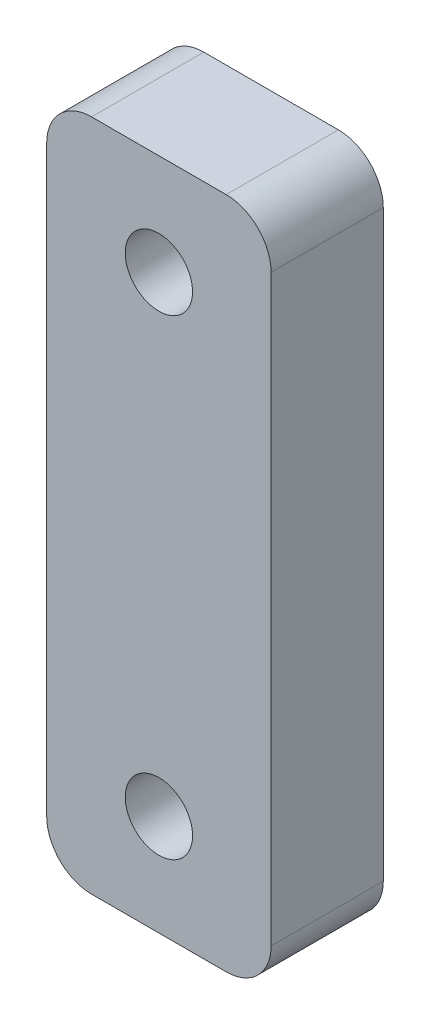
ISO-10303-21;
HEADER;
FILE_DESCRIPTION(('STEP AP214'),'2;1');
FILE_NAME('part.step','',(''),(''),'','','');
FILE_SCHEMA(('AUTOMOTIVE_DESIGN { 1 0 10303 214 1 1 1 1 }'));
ENDSEC;
DATA;
#1=APPLICATION_CONTEXT('core data for automotive mechanical design processes');
#2=APPLICATION_PROTOCOL_DEFINITION('international standard','automotive_design',2000,#1);
#3=PRODUCT_CONTEXT('',#1,'mechanical');
#4=PRODUCT('Part','Part','',(#3));
#5=PRODUCT_RELATED_PRODUCT_CATEGORY('part','',(#4));
#6=PRODUCT_DEFINITION_FORMATION('','',#4);
#7=PRODUCT_DEFINITION_CONTEXT('part definition',#1,'design');
#8=PRODUCT_DEFINITION('design','',#6,#7);
#9=PRODUCT_DEFINITION_SHAPE('','',#8);
#10=(LENGTH_UNIT() NAMED_UNIT(*) SI_UNIT(.MILLI.,.METRE.));
#11=(NAMED_UNIT(*) PLANE_ANGLE_UNIT() SI_UNIT($,.RADIAN.));
#12=(NAMED_UNIT(*) SI_UNIT($,.STERADIAN.) SOLID_ANGLE_UNIT());
#13=UNCERTAINTY_MEASURE_WITH_UNIT(LENGTH_MEASURE(1.E-05),#10,'distance_accuracy_value','');
#14=(GEOMETRIC_REPRESENTATION_CONTEXT(3) GLOBAL_UNCERTAINTY_ASSIGNED_CONTEXT((#13)) GLOBAL_UNIT_ASSIGNED_CONTEXT((#10,
#11,#12)) REPRESENTATION_CONTEXT('',''));
#15=CARTESIAN_POINT('',(0.,0.,0.));
#16=DIRECTION('',(0.,0.,1.));
#17=DIRECTION('',(1.,0.,0.));
#18=AXIS2_PLACEMENT_3D('',#15,#16,#17);
#19=CARTESIAN_POINT('',(-5.,-15.,5.));
#20=DIRECTION('',(1.,0.,0.));
#21=DIRECTION('',(0.,0.,-1.));
#22=AXIS2_PLACEMENT_3D('',#19,#20,#21);
#23=PLANE('',#22);
#24=DIRECTION('',(0.,-1.,0.));
#25=VECTOR('',#24,1.);
#26=CARTESIAN_POINT('',(-5.,-15.,0.));
#27=LINE('',#26,#25);
#28=CARTESIAN_POINT('',(-5.,13.,0.));
#29=VERTEX_POINT('',#28);
#30=CARTESIAN_POINT('',(-5.,-13.,0.));
#31=VERTEX_POINT('',#30);
#32=EDGE_CURVE('E145',#29,#31,#27,.T.);
#33=ORIENTED_EDGE('',*,*,#32,.T.);
#34=DIRECTION('',(0.,0.,-1.));
#35=VECTOR('',#34,1.);
#36=CARTESIAN_POINT('',(-5.,-13.,5.));
#37=LINE('',#36,#35);
#38=CARTESIAN_POINT('',(-5.,-13.,5.));
#39=VERTEX_POINT('',#38);
#40=EDGE_CURVE('E178',#31,#39,#37,.F.);
#41=ORIENTED_EDGE('',*,*,#40,.T.);
#42=DIRECTION('',(0.,-1.,0.));
#43=VECTOR('',#42,1.);
#44=CARTESIAN_POINT('',(-5.,-15.,5.));
#45=LINE('',#44,#43);
#46=CARTESIAN_POINT('',(-5.,13.,5.));
#47=VERTEX_POINT('',#46);
#48=EDGE_CURVE('E143',#47,#39,#45,.T.);
#49=ORIENTED_EDGE('',*,*,#48,.F.);
#50=DIRECTION('',(0.,0.,-1.));
#51=VECTOR('',#50,1.);
#52=CARTESIAN_POINT('',(-5.,13.,5.));
#53=LINE('',#52,#51);
#54=EDGE_CURVE('E174',#47,#29,#53,.T.);
#55=ORIENTED_EDGE('',*,*,#54,.T.);
#56=EDGE_LOOP('',(#33,#41,#49,#55));
#57=FACE_BOUND('',#56,.T.);
#58=ADVANCED_FACE('F42',(#57),#23,.F.);
#59=CARTESIAN_POINT('',(5.,-15.,5.));
#60=DIRECTION('',(0.,1.,0.));
#61=DIRECTION('',(-1.,0.,0.));
#62=AXIS2_PLACEMENT_3D('',#59,#60,#61);
#63=PLANE('',#62);
#64=DIRECTION('',(1.,0.,0.));
#65=VECTOR('',#64,1.);
#66=CARTESIAN_POINT('',(5.,-15.,0.));
#67=LINE('',#66,#65);
#68=CARTESIAN_POINT('',(-3.,-15.,0.));
#69=VERTEX_POINT('',#68);
#70=CARTESIAN_POINT('',(3.,-15.,0.));
#71=VERTEX_POINT('',#70);
#72=EDGE_CURVE('E139',#69,#71,#67,.T.);
#73=ORIENTED_EDGE('',*,*,#72,.T.);
#74=DIRECTION('',(0.,0.,-1.));
#75=VECTOR('',#74,1.);
#76=CARTESIAN_POINT('',(3.,-15.,5.));
#77=LINE('',#76,#75);
#78=CARTESIAN_POINT('',(3.,-15.,5.));
#79=VERTEX_POINT('',#78);
#80=EDGE_CURVE('E114',#71,#79,#77,.F.);
#81=ORIENTED_EDGE('',*,*,#80,.T.);
#82=DIRECTION('',(1.,0.,0.));
#83=VECTOR('',#82,1.);
#84=CARTESIAN_POINT('',(5.,-15.,5.));
#85=LINE('',#84,#83);
#86=CARTESIAN_POINT('',(-3.,-15.,5.));
#87=VERTEX_POINT('',#86);
#88=EDGE_CURVE('E185',#87,#79,#85,.T.);
#89=ORIENTED_EDGE('',*,*,#88,.F.);
#90=DIRECTION('',(0.,0.,-1.));
#91=VECTOR('',#90,1.);
#92=CARTESIAN_POINT('',(-3.,-15.,5.));
#93=LINE('',#92,#91);
#94=EDGE_CURVE('E120',#87,#69,#93,.T.);
#95=ORIENTED_EDGE('',*,*,#94,.T.);
#96=EDGE_LOOP('',(#73,#81,#89,#95));
#97=FACE_BOUND('',#96,.T.);
#98=ADVANCED_FACE('F237',(#97),#63,.F.);
#99=CARTESIAN_POINT('',(5.,-15.,5.));
#100=DIRECTION('',(-1.,0.,0.));
#101=DIRECTION('',(0.,0.,1.));
#102=AXIS2_PLACEMENT_3D('',#99,#100,#101);
#103=PLANE('',#102);
#104=DIRECTION('',(0.,1.,0.));
#105=VECTOR('',#104,1.);
#106=CARTESIAN_POINT('',(5.,-15.,5.));
#107=LINE('',#106,#105);
#108=CARTESIAN_POINT('',(5.,-13.,5.));
#109=VERTEX_POINT('',#108);
#110=CARTESIAN_POINT('',(5.,13.,5.));
#111=VERTEX_POINT('',#110);
#112=EDGE_CURVE('E129',#109,#111,#107,.T.);
#113=ORIENTED_EDGE('',*,*,#112,.F.);
#114=DIRECTION('',(0.,0.,-1.));
#115=VECTOR('',#114,1.);
#116=CARTESIAN_POINT('',(5.,-13.,5.));
#117=LINE('',#116,#115);
#118=CARTESIAN_POINT('',(5.,-13.,0.));
#119=VERTEX_POINT('',#118);
#120=EDGE_CURVE('E113',#109,#119,#117,.T.);
#121=ORIENTED_EDGE('',*,*,#120,.T.);
#122=DIRECTION('',(0.,1.,0.));
#123=VECTOR('',#122,1.);
#124=CARTESIAN_POINT('',(5.,-15.,0.));
#125=LINE('',#124,#123);
#126=CARTESIAN_POINT('',(5.,13.,0.));
#127=VERTEX_POINT('',#126);
#128=EDGE_CURVE('E127',#119,#127,#125,.T.);
#129=ORIENTED_EDGE('',*,*,#128,.T.);
#130=DIRECTION('',(0.,0.,-1.));
#131=VECTOR('',#130,1.);
#132=CARTESIAN_POINT('',(5.,13.,5.));
#133=LINE('',#132,#131);
#134=EDGE_CURVE('E132',#127,#111,#133,.F.);
#135=ORIENTED_EDGE('',*,*,#134,.T.);
#136=EDGE_LOOP('',(#113,#121,#129,#135));
#137=FACE_BOUND('',#136,.T.);
#138=ADVANCED_FACE('F126',(#137),#103,.F.);
#139=CARTESIAN_POINT('',(5.,15.,5.));
#140=DIRECTION('',(0.,-1.,0.));
#141=DIRECTION('',(1.,0.,0.));
#142=AXIS2_PLACEMENT_3D('',#139,#140,#141);
#143=PLANE('',#142);
#144=DIRECTION('',(-1.,0.,0.));
#145=VECTOR('',#144,1.);
#146=CARTESIAN_POINT('',(5.,15.,5.));
#147=LINE('',#146,#145);
#148=CARTESIAN_POINT('',(3.,15.,5.));
#149=VERTEX_POINT('',#148);
#150=CARTESIAN_POINT('',(-3.,15.,5.));
#151=VERTEX_POINT('',#150);
#152=EDGE_CURVE('E150',#149,#151,#147,.T.);
#153=ORIENTED_EDGE('',*,*,#152,.F.);
#154=DIRECTION('',(0.,0.,-1.));
#155=VECTOR('',#154,1.);
#156=CARTESIAN_POINT('',(3.,15.,5.));
#157=LINE('',#156,#155);
#158=CARTESIAN_POINT('',(3.,15.,0.));
#159=VERTEX_POINT('',#158);
#160=EDGE_CURVE('E11',#149,#159,#157,.T.);
#161=ORIENTED_EDGE('',*,*,#160,.T.);
#162=DIRECTION('',(-1.,0.,0.));
#163=VECTOR('',#162,1.);
#164=CARTESIAN_POINT('',(5.,15.,0.));
#165=LINE('',#164,#163);
#166=CARTESIAN_POINT('',(-3.,15.,0.));
#167=VERTEX_POINT('',#166);
#168=EDGE_CURVE('E138',#159,#167,#165,.T.);
#169=ORIENTED_EDGE('',*,*,#168,.T.);
#170=DIRECTION('',(0.,0.,-1.));
#171=VECTOR('',#170,1.);
#172=CARTESIAN_POINT('',(-3.,15.,5.));
#173=LINE('',#172,#171);
#174=EDGE_CURVE('E51',#167,#151,#173,.F.);
#175=ORIENTED_EDGE('',*,*,#174,.T.);
#176=EDGE_LOOP('',(#153,#161,#169,#175));
#177=FACE_BOUND('',#176,.T.);
#178=ADVANCED_FACE('F260',(#177),#143,.F.);
#179=CARTESIAN_POINT('',(0.,0.,5.));
#180=DIRECTION('',(0.,0.,1.));
#181=DIRECTION('',(1.,0.,0.));
#182=AXIS2_PLACEMENT_3D('',#179,#180,#181);
#183=PLANE('',#182);
#184=CARTESIAN_POINT('',(0.,-10.5,5.));
#185=DIRECTION('',(0.,0.,1.));
#186=DIRECTION('',(1.,0.,0.));
#187=AXIS2_PLACEMENT_3D('',#184,#185,#186);
#188=CIRCLE('',#187,1.5);
#189=CARTESIAN_POINT('',(1.5,-10.5,5.));
#190=VERTEX_POINT('',#189);
#191=EDGE_CURVE('E205',#190,#190,#188,.T.);
#192=ORIENTED_EDGE('',*,*,#191,.F.);
#193=EDGE_LOOP('',(#192));
#194=FACE_BOUND('',#193,.T.);
#195=CARTESIAN_POINT('',(0.,10.5,5.));
#196=DIRECTION('',(0.,0.,1.));
#197=DIRECTION('',(-1.,0.,0.));
#198=AXIS2_PLACEMENT_3D('',#195,#196,#197);
#199=CIRCLE('',#198,1.5);
#200=CARTESIAN_POINT('',(-1.50000000000001,10.5,5.));
#201=VERTEX_POINT('',#200);
#202=EDGE_CURVE('E211',#201,#201,#199,.T.);
#203=ORIENTED_EDGE('',*,*,#202,.F.);
#204=EDGE_LOOP('',(#203));
#205=FACE_BOUND('',#204,.T.);
#206=ORIENTED_EDGE('',*,*,#88,.T.);
#207=CARTESIAN_POINT('',(3.,-13.,5.));
#208=DIRECTION('',(0.,0.,1.));
#209=DIRECTION('',(1.,0.,0.));
#210=AXIS2_PLACEMENT_3D('',#207,#208,#209);
#211=CIRCLE('',#210,2.);
#212=EDGE_CURVE('E171',#79,#109,#211,.T.);
#213=ORIENTED_EDGE('',*,*,#212,.T.);
#214=ORIENTED_EDGE('',*,*,#112,.T.);
#215=CARTESIAN_POINT('',(3.,13.,5.));
#216=DIRECTION('',(0.,0.,1.));
#217=DIRECTION('',(1.,0.,0.));
#218=AXIS2_PLACEMENT_3D('',#215,#216,#217);
#219=CIRCLE('',#218,2.);
#220=EDGE_CURVE('E64',#111,#149,#219,.T.);
#221=ORIENTED_EDGE('',*,*,#220,.T.);
#222=ORIENTED_EDGE('',*,*,#152,.T.);
#223=CARTESIAN_POINT('',(-3.,13.,5.));
#224=DIRECTION('',(0.,0.,1.));
#225=DIRECTION('',(1.,0.,0.));
#226=AXIS2_PLACEMENT_3D('',#223,#224,#225);
#227=CIRCLE('',#226,2.);
#228=EDGE_CURVE('E163',#151,#47,#227,.T.);
#229=ORIENTED_EDGE('',*,*,#228,.T.);
#230=ORIENTED_EDGE('',*,*,#48,.T.);
#231=CARTESIAN_POINT('',(-3.,-13.,5.));
#232=DIRECTION('',(0.,0.,1.));
#233=DIRECTION('',(1.,0.,0.));
#234=AXIS2_PLACEMENT_3D('',#231,#232,#233);
#235=CIRCLE('',#234,2.);
#236=EDGE_CURVE('E168',#39,#87,#235,.T.);
#237=ORIENTED_EDGE('',*,*,#236,.T.);
#238=EDGE_LOOP('',(#206,#213,#214,#221,#222,#229,#230,#237));
#239=FACE_BOUND('',#238,.T.);
#240=ADVANCED_FACE('F233',(#194,#205,#239),#183,.T.);
#241=CARTESIAN_POINT('',(0.,0.,0.));
#242=DIRECTION('',(0.,0.,1.));
#243=DIRECTION('',(1.,0.,0.));
#244=AXIS2_PLACEMENT_3D('',#241,#242,#243);
#245=PLANE('',#244);
#246=CARTESIAN_POINT('',(0.,-10.5,0.));
#247=DIRECTION('',(0.,0.,1.));
#248=DIRECTION('',(1.,0.,0.));
#249=AXIS2_PLACEMENT_3D('',#246,#247,#248);
#250=CIRCLE('',#249,1.5);
#251=CARTESIAN_POINT('',(1.5,-10.5,0.));
#252=VERTEX_POINT('',#251);
#253=EDGE_CURVE('E199',#252,#252,#250,.T.);
#254=ORIENTED_EDGE('',*,*,#253,.T.);
#255=EDGE_LOOP('',(#254));
#256=FACE_BOUND('',#255,.T.);
#257=CARTESIAN_POINT('',(0.,10.5,0.));
#258=DIRECTION('',(0.,0.,1.));
#259=DIRECTION('',(-1.,0.,0.));
#260=AXIS2_PLACEMENT_3D('',#257,#258,#259);
#261=CIRCLE('',#260,1.5);
#262=CARTESIAN_POINT('',(-1.50000000000001,10.5,0.));
#263=VERTEX_POINT('',#262);
#264=EDGE_CURVE('E195',#263,#263,#261,.T.);
#265=ORIENTED_EDGE('',*,*,#264,.T.);
#266=EDGE_LOOP('',(#265));
#267=FACE_BOUND('',#266,.T.);
#268=ORIENTED_EDGE('',*,*,#128,.F.);
#269=CARTESIAN_POINT('',(3.,-13.,0.));
#270=DIRECTION('',(0.,0.,1.));
#271=DIRECTION('',(1.,0.,0.));
#272=AXIS2_PLACEMENT_3D('',#269,#270,#271);
#273=CIRCLE('',#272,2.);
#274=EDGE_CURVE('E109',#119,#71,#273,.F.);
#275=ORIENTED_EDGE('',*,*,#274,.T.);
#276=ORIENTED_EDGE('',*,*,#72,.F.);
#277=CARTESIAN_POINT('',(-3.,-13.,0.));
#278=DIRECTION('',(0.,0.,1.));
#279=DIRECTION('',(1.,0.,0.));
#280=AXIS2_PLACEMENT_3D('',#277,#278,#279);
#281=CIRCLE('',#280,2.);
#282=EDGE_CURVE('E121',#69,#31,#281,.F.);
#283=ORIENTED_EDGE('',*,*,#282,.T.);
#284=ORIENTED_EDGE('',*,*,#32,.F.);
#285=CARTESIAN_POINT('',(-3.,13.,0.));
#286=DIRECTION('',(0.,0.,1.));
#287=DIRECTION('',(1.,0.,0.));
#288=AXIS2_PLACEMENT_3D('',#285,#286,#287);
#289=CIRCLE('',#288,2.);
#290=EDGE_CURVE('E131',#29,#167,#289,.F.);
#291=ORIENTED_EDGE('',*,*,#290,.T.);
#292=ORIENTED_EDGE('',*,*,#168,.F.);
#293=CARTESIAN_POINT('',(3.,13.,0.));
#294=DIRECTION('',(0.,0.,1.));
#295=DIRECTION('',(1.,0.,0.));
#296=AXIS2_PLACEMENT_3D('',#293,#294,#295);
#297=CIRCLE('',#296,2.);
#298=EDGE_CURVE('E136',#159,#127,#297,.F.);
#299=ORIENTED_EDGE('',*,*,#298,.T.);
#300=EDGE_LOOP('',(#268,#275,#276,#283,#284,#291,#292,#299));
#301=FACE_BOUND('',#300,.T.);
#302=ADVANCED_FACE('F134',(#256,#267,#301),#245,.F.);
#303=CARTESIAN_POINT('',(0.,10.5,0.));
#304=DIRECTION('',(0.,0.,1.));
#305=DIRECTION('',(1.,0.,0.));
#306=AXIS2_PLACEMENT_3D('',#303,#304,#305);
#307=CYLINDRICAL_SURFACE('',#306,1.5);
#308=ORIENTED_EDGE('',*,*,#264,.F.);
#309=EDGE_LOOP('',(#308));
#310=FACE_BOUND('',#309,.T.);
#311=ORIENTED_EDGE('',*,*,#202,.T.);
#312=EDGE_LOOP('',(#311));
#313=FACE_BOUND('',#312,.T.);
#314=ADVANCED_FACE('F222',(#310,#313),#307,.F.);
#315=CARTESIAN_POINT('',(0.,-10.5,0.));
#316=DIRECTION('',(0.,0.,1.));
#317=DIRECTION('',(1.,0.,0.));
#318=AXIS2_PLACEMENT_3D('',#315,#316,#317);
#319=CYLINDRICAL_SURFACE('',#318,1.5);
#320=ORIENTED_EDGE('',*,*,#253,.F.);
#321=EDGE_LOOP('',(#320));
#322=FACE_BOUND('',#321,.T.);
#323=ORIENTED_EDGE('',*,*,#191,.T.);
#324=EDGE_LOOP('',(#323));
#325=FACE_BOUND('',#324,.T.);
#326=ADVANCED_FACE('F224',(#322,#325),#319,.F.);
#327=CARTESIAN_POINT('',(3.,-13.,5.));
#328=DIRECTION('',(0.,0.,-1.));
#329=DIRECTION('',(-1.,0.,0.));
#330=AXIS2_PLACEMENT_3D('',#327,#328,#329);
#331=CYLINDRICAL_SURFACE('',#330,2.);
#332=ORIENTED_EDGE('',*,*,#212,.F.);
#333=ORIENTED_EDGE('',*,*,#80,.F.);
#334=ORIENTED_EDGE('',*,*,#274,.F.);
#335=ORIENTED_EDGE('',*,*,#120,.F.);
#336=EDGE_LOOP('',(#332,#333,#334,#335));
#337=FACE_BOUND('',#336,.T.);
#338=ADVANCED_FACE('F112',(#337),#331,.T.);
#339=CARTESIAN_POINT('',(-3.,-13.,5.));
#340=DIRECTION('',(0.,0.,-1.));
#341=DIRECTION('',(-1.,0.,0.));
#342=AXIS2_PLACEMENT_3D('',#339,#340,#341);
#343=CYLINDRICAL_SURFACE('',#342,2.);
#344=ORIENTED_EDGE('',*,*,#236,.F.);
#345=ORIENTED_EDGE('',*,*,#40,.F.);
#346=ORIENTED_EDGE('',*,*,#282,.F.);
#347=ORIENTED_EDGE('',*,*,#94,.F.);
#348=EDGE_LOOP('',(#344,#345,#346,#347));
#349=FACE_BOUND('',#348,.T.);
#350=ADVANCED_FACE('F249',(#349),#343,.T.);
#351=CARTESIAN_POINT('',(3.,13.,5.));
#352=DIRECTION('',(0.,0.,-1.));
#353=DIRECTION('',(-1.,0.,0.));
#354=AXIS2_PLACEMENT_3D('',#351,#352,#353);
#355=CYLINDRICAL_SURFACE('',#354,2.);
#356=ORIENTED_EDGE('',*,*,#220,.F.);
#357=ORIENTED_EDGE('',*,*,#134,.F.);
#358=ORIENTED_EDGE('',*,*,#298,.F.);
#359=ORIENTED_EDGE('',*,*,#160,.F.);
#360=EDGE_LOOP('',(#356,#357,#358,#359));
#361=FACE_BOUND('',#360,.T.);
#362=ADVANCED_FACE('F251',(#361),#355,.T.);
#363=CARTESIAN_POINT('',(-3.,13.,5.));
#364=DIRECTION('',(0.,0.,-1.));
#365=DIRECTION('',(-1.,0.,0.));
#366=AXIS2_PLACEMENT_3D('',#363,#364,#365);
#367=CYLINDRICAL_SURFACE('',#366,2.);
#368=ORIENTED_EDGE('',*,*,#228,.F.);
#369=ORIENTED_EDGE('',*,*,#174,.F.);
#370=ORIENTED_EDGE('',*,*,#290,.F.);
#371=ORIENTED_EDGE('',*,*,#54,.F.);
#372=EDGE_LOOP('',(#368,#369,#370,#371));
#373=FACE_BOUND('',#372,.T.);
#374=ADVANCED_FACE('F44',(#373),#367,.T.);
#375=CLOSED_SHELL('',(#58,#98,#138,#178,#240,#302,#314,#326,#338,#350,#362,#374));
#376=MANIFOLD_SOLID_BREP('B2',#375);
#377=ADVANCED_BREP_SHAPE_REPRESENTATION('',(#18,#376),#14);
#378=SHAPE_DEFINITION_REPRESENTATION(#9,#377);
ENDSEC;
END-ISO-10303-21;
